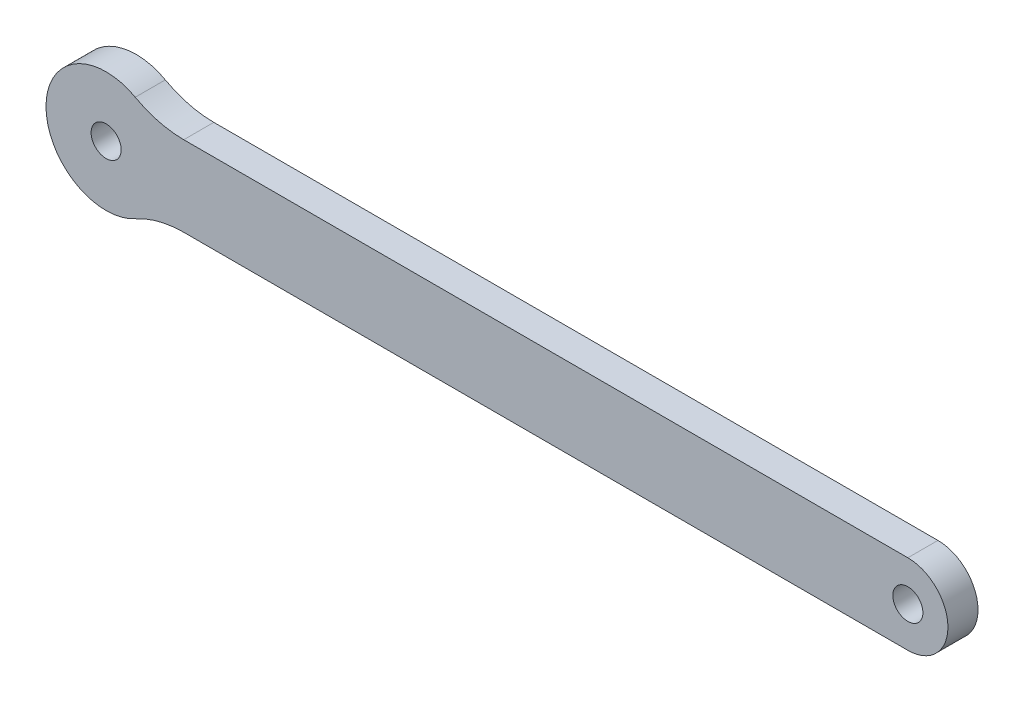
ISO-10303-21;
HEADER;
FILE_DESCRIPTION(('STEP AP214'),'2;1');
FILE_NAME('part.step','',(''),(''),'','','');
FILE_SCHEMA(('AUTOMOTIVE_DESIGN { 1 0 10303 214 1 1 1 1 }'));
ENDSEC;
DATA;
#1=APPLICATION_CONTEXT('core data for automotive mechanical design processes');
#2=APPLICATION_PROTOCOL_DEFINITION('international standard','automotive_design',2000,#1);
#3=PRODUCT_CONTEXT('',#1,'mechanical');
#4=PRODUCT('Part','Part','',(#3));
#5=PRODUCT_RELATED_PRODUCT_CATEGORY('part','',(#4));
#6=PRODUCT_DEFINITION_FORMATION('','',#4);
#7=PRODUCT_DEFINITION_CONTEXT('part definition',#1,'design');
#8=PRODUCT_DEFINITION('design','',#6,#7);
#9=PRODUCT_DEFINITION_SHAPE('','',#8);
#10=(LENGTH_UNIT() NAMED_UNIT(*) SI_UNIT(.MILLI.,.METRE.));
#11=(NAMED_UNIT(*) PLANE_ANGLE_UNIT() SI_UNIT($,.RADIAN.));
#12=(NAMED_UNIT(*) SI_UNIT($,.STERADIAN.) SOLID_ANGLE_UNIT());
#13=UNCERTAINTY_MEASURE_WITH_UNIT(LENGTH_MEASURE(1.E-05),#10,'distance_accuracy_value','');
#14=(GEOMETRIC_REPRESENTATION_CONTEXT(3) GLOBAL_UNCERTAINTY_ASSIGNED_CONTEXT((#13)) GLOBAL_UNIT_ASSIGNED_CONTEXT((#10,
#11,#12)) REPRESENTATION_CONTEXT('',''));
#15=CARTESIAN_POINT('',(0.,0.,0.));
#16=DIRECTION('',(0.,0.,1.));
#17=DIRECTION('',(1.,0.,0.));
#18=AXIS2_PLACEMENT_3D('',#15,#16,#17);
#19=CARTESIAN_POINT('',(126.393109195494,47.5642070296617,3.));
#20=DIRECTION('',(0.,0.,-1.));
#21=DIRECTION('',(-1.,0.,0.));
#22=AXIS2_PLACEMENT_3D('',#19,#20,#21);
#23=PLANE('',#22);
#24=CARTESIAN_POINT('',(118.647142503079,61.5642070296617,3.));
#25=DIRECTION('',(0.,0.,1.));
#26=DIRECTION('',(1.,0.,0.));
#27=AXIS2_PLACEMENT_3D('',#24,#25,#26);
#28=CIRCLE('',#27,1.5);
#29=CARTESIAN_POINT('',(120.147142503079,61.5642070296617,3.));
#30=VERTEX_POINT('',#29);
#31=EDGE_CURVE('E126',#30,#30,#28,.T.);
#32=ORIENTED_EDGE('',*,*,#31,.F.);
#33=EDGE_LOOP('',(#32));
#34=FACE_BOUND('',#33,.T.);
#35=CARTESIAN_POINT('',(126.393109195494,47.5642070296617,3.));
#36=DIRECTION('',(0.,0.,-1.));
#37=DIRECTION('',(-1.,0.,0.));
#38=AXIS2_PLACEMENT_3D('',#35,#36,#37);
#39=CIRCLE('',#38,10.);
#40=CARTESIAN_POINT('',(121.551880012734,56.3142070296617,3.));
#41=VERTEX_POINT('',#40);
#42=CARTESIAN_POINT('',(126.393109195494,57.5642070296616,3.));
#43=VERTEX_POINT('',#42);
#44=EDGE_CURVE('E133',#41,#43,#39,.T.);
#45=ORIENTED_EDGE('',*,*,#44,.T.);
#46=DIRECTION('',(1.,0.,0.));
#47=VECTOR('',#46,1.);
#48=CARTESIAN_POINT('',(126.393109195494,57.5642070296616,3.));
#49=LINE('',#48,#47);
#50=CARTESIAN_POINT('',(198.647142503079,57.5642070296617,3.));
#51=VERTEX_POINT('',#50);
#52=EDGE_CURVE('E91',#43,#51,#49,.T.);
#53=ORIENTED_EDGE('',*,*,#52,.T.);
#54=CARTESIAN_POINT('',(198.647142503079,61.5642070296617,3.));
#55=DIRECTION('',(0.,0.,1.));
#56=DIRECTION('',(1.,0.,0.));
#57=AXIS2_PLACEMENT_3D('',#54,#55,#56);
#58=CIRCLE('',#57,4.);
#59=CARTESIAN_POINT('',(198.647142503079,65.5642070296616,3.));
#60=VERTEX_POINT('',#59);
#61=EDGE_CURVE('E104',#51,#60,#58,.T.);
#62=ORIENTED_EDGE('',*,*,#61,.T.);
#63=DIRECTION('',(-1.,0.,0.));
#64=VECTOR('',#63,1.);
#65=CARTESIAN_POINT('',(198.647142503079,65.5642070296616,3.));
#66=LINE('',#65,#64);
#67=CARTESIAN_POINT('',(126.393109195494,65.5642070296616,3.));
#68=VERTEX_POINT('',#67);
#69=EDGE_CURVE('E98',#60,#68,#66,.T.);
#70=ORIENTED_EDGE('',*,*,#69,.T.);
#71=CARTESIAN_POINT('',(126.393109195494,75.5642070296616,3.));
#72=DIRECTION('',(0.,0.,-1.));
#73=DIRECTION('',(1.,0.,0.));
#74=AXIS2_PLACEMENT_3D('',#71,#72,#73);
#75=CIRCLE('',#74,10.);
#76=CARTESIAN_POINT('',(121.551880012734,66.8142070296616,3.));
#77=VERTEX_POINT('',#76);
#78=EDGE_CURVE('E102',#68,#77,#75,.T.);
#79=ORIENTED_EDGE('',*,*,#78,.T.);
#80=CARTESIAN_POINT('',(118.647142503079,61.5642070296617,3.));
#81=DIRECTION('',(0.,0.,1.));
#82=DIRECTION('',(1.,0.,0.));
#83=AXIS2_PLACEMENT_3D('',#80,#81,#82);
#84=CIRCLE('',#83,6.);
#85=EDGE_CURVE('E54',#77,#41,#84,.T.);
#86=ORIENTED_EDGE('',*,*,#85,.T.);
#87=EDGE_LOOP('',(#45,#53,#62,#70,#79,#86));
#88=FACE_BOUND('',#87,.T.);
#89=CARTESIAN_POINT('',(198.647142503079,61.5642070296617,3.));
#90=DIRECTION('',(0.,0.,1.));
#91=DIRECTION('',(1.,0.,0.));
#92=AXIS2_PLACEMENT_3D('',#89,#90,#91);
#93=CIRCLE('',#92,1.5);
#94=CARTESIAN_POINT('',(200.147142503079,61.5642070296617,3.));
#95=VERTEX_POINT('',#94);
#96=EDGE_CURVE('E176',#95,#95,#93,.T.);
#97=ORIENTED_EDGE('',*,*,#96,.F.);
#98=EDGE_LOOP('',(#97));
#99=FACE_BOUND('',#98,.T.);
#100=ADVANCED_FACE('F37',(#34,#88,#99),#23,.F.);
#101=CARTESIAN_POINT('',(126.393109195494,47.5642070296617,0.));
#102=DIRECTION('',(0.,0.,-1.));
#103=DIRECTION('',(-1.,0.,0.));
#104=AXIS2_PLACEMENT_3D('',#101,#102,#103);
#105=PLANE('',#104);
#106=CARTESIAN_POINT('',(118.647142503079,61.5642070296617,0.));
#107=DIRECTION('',(0.,0.,1.));
#108=DIRECTION('',(1.,0.,0.));
#109=AXIS2_PLACEMENT_3D('',#106,#107,#108);
#110=CIRCLE('',#109,1.5);
#111=CARTESIAN_POINT('',(120.147142503079,61.5642070296617,0.));
#112=VERTEX_POINT('',#111);
#113=EDGE_CURVE('E181',#112,#112,#110,.T.);
#114=ORIENTED_EDGE('',*,*,#113,.T.);
#115=EDGE_LOOP('',(#114));
#116=FACE_BOUND('',#115,.T.);
#117=CARTESIAN_POINT('',(126.393109195494,47.5642070296617,0.));
#118=DIRECTION('',(0.,0.,-1.));
#119=DIRECTION('',(-1.,0.,0.));
#120=AXIS2_PLACEMENT_3D('',#117,#118,#119);
#121=CIRCLE('',#120,10.);
#122=CARTESIAN_POINT('',(121.551880012734,56.3142070296617,0.));
#123=VERTEX_POINT('',#122);
#124=CARTESIAN_POINT('',(126.393109195494,57.5642070296616,0.));
#125=VERTEX_POINT('',#124);
#126=EDGE_CURVE('E122',#123,#125,#121,.T.);
#127=ORIENTED_EDGE('',*,*,#126,.F.);
#128=CARTESIAN_POINT('',(118.647142503079,61.5642070296617,0.));
#129=DIRECTION('',(0.,0.,1.));
#130=DIRECTION('',(1.,0.,0.));
#131=AXIS2_PLACEMENT_3D('',#128,#129,#130);
#132=CIRCLE('',#131,6.);
#133=CARTESIAN_POINT('',(121.551880012734,66.8142070296616,0.));
#134=VERTEX_POINT('',#133);
#135=EDGE_CURVE('E83',#134,#123,#132,.T.);
#136=ORIENTED_EDGE('',*,*,#135,.F.);
#137=CARTESIAN_POINT('',(126.393109195494,75.5642070296616,0.));
#138=DIRECTION('',(0.,0.,-1.));
#139=DIRECTION('',(1.,0.,0.));
#140=AXIS2_PLACEMENT_3D('',#137,#138,#139);
#141=CIRCLE('',#140,10.);
#142=CARTESIAN_POINT('',(126.393109195494,65.5642070296616,0.));
#143=VERTEX_POINT('',#142);
#144=EDGE_CURVE('E77',#143,#134,#141,.T.);
#145=ORIENTED_EDGE('',*,*,#144,.F.);
#146=DIRECTION('',(-1.,0.,0.));
#147=VECTOR('',#146,1.);
#148=CARTESIAN_POINT('',(198.647142503079,65.5642070296616,0.));
#149=LINE('',#148,#147);
#150=CARTESIAN_POINT('',(198.647142503079,65.5642070296616,0.));
#151=VERTEX_POINT('',#150);
#152=EDGE_CURVE('E112',#151,#143,#149,.T.);
#153=ORIENTED_EDGE('',*,*,#152,.F.);
#154=CARTESIAN_POINT('',(198.647142503079,61.5642070296617,0.));
#155=DIRECTION('',(0.,0.,1.));
#156=DIRECTION('',(1.,0.,0.));
#157=AXIS2_PLACEMENT_3D('',#154,#155,#156);
#158=CIRCLE('',#157,4.);
#159=CARTESIAN_POINT('',(198.647142503079,57.5642070296617,0.));
#160=VERTEX_POINT('',#159);
#161=EDGE_CURVE('E128',#160,#151,#158,.T.);
#162=ORIENTED_EDGE('',*,*,#161,.F.);
#163=DIRECTION('',(1.,0.,0.));
#164=VECTOR('',#163,1.);
#165=CARTESIAN_POINT('',(126.393109195494,57.5642070296616,0.));
#166=LINE('',#165,#164);
#167=EDGE_CURVE('E125',#125,#160,#166,.T.);
#168=ORIENTED_EDGE('',*,*,#167,.F.);
#169=EDGE_LOOP('',(#127,#136,#145,#153,#162,#168));
#170=FACE_BOUND('',#169,.T.);
#171=CARTESIAN_POINT('',(198.647142503079,61.5642070296617,0.));
#172=DIRECTION('',(0.,0.,1.));
#173=DIRECTION('',(1.,0.,0.));
#174=AXIS2_PLACEMENT_3D('',#171,#172,#173);
#175=CIRCLE('',#174,1.5);
#176=CARTESIAN_POINT('',(200.147142503079,61.5642070296617,0.));
#177=VERTEX_POINT('',#176);
#178=EDGE_CURVE('E179',#177,#177,#175,.T.);
#179=ORIENTED_EDGE('',*,*,#178,.T.);
#180=EDGE_LOOP('',(#179));
#181=FACE_BOUND('',#180,.T.);
#182=ADVANCED_FACE('F142',(#116,#170,#181),#105,.T.);
#183=CARTESIAN_POINT('',(126.393109195494,47.5642070296617,3.));
#184=DIRECTION('',(0.,0.,-1.));
#185=DIRECTION('',(-1.,0.,0.));
#186=AXIS2_PLACEMENT_3D('',#183,#184,#185);
#187=CYLINDRICAL_SURFACE('',#186,10.);
#188=ORIENTED_EDGE('',*,*,#126,.T.);
#189=DIRECTION('',(0.,0.,-1.));
#190=VECTOR('',#189,1.);
#191=CARTESIAN_POINT('',(126.393109195494,57.5642070296616,3.));
#192=LINE('',#191,#190);
#193=EDGE_CURVE('E11',#43,#125,#192,.T.);
#194=ORIENTED_EDGE('',*,*,#193,.F.);
#195=ORIENTED_EDGE('',*,*,#44,.F.);
#196=DIRECTION('',(0.,0.,-1.));
#197=VECTOR('',#196,1.);
#198=CARTESIAN_POINT('',(121.551880012734,56.3142070296617,3.));
#199=LINE('',#198,#197);
#200=EDGE_CURVE('E118',#41,#123,#199,.T.);
#201=ORIENTED_EDGE('',*,*,#200,.T.);
#202=EDGE_LOOP('',(#188,#194,#195,#201));
#203=FACE_BOUND('',#202,.T.);
#204=ADVANCED_FACE('F39',(#203),#187,.F.);
#205=CARTESIAN_POINT('',(126.393109195494,57.5642070296616,3.));
#206=DIRECTION('',(0.,1.,0.));
#207=DIRECTION('',(-1.,0.,0.));
#208=AXIS2_PLACEMENT_3D('',#205,#206,#207);
#209=PLANE('',#208);
#210=ORIENTED_EDGE('',*,*,#167,.T.);
#211=DIRECTION('',(0.,0.,-1.));
#212=VECTOR('',#211,1.);
#213=CARTESIAN_POINT('',(198.647142503079,57.5642070296617,3.));
#214=LINE('',#213,#212);
#215=EDGE_CURVE('E46',#51,#160,#214,.T.);
#216=ORIENTED_EDGE('',*,*,#215,.F.);
#217=ORIENTED_EDGE('',*,*,#52,.F.);
#218=ORIENTED_EDGE('',*,*,#193,.T.);
#219=EDGE_LOOP('',(#210,#216,#217,#218));
#220=FACE_BOUND('',#219,.T.);
#221=ADVANCED_FACE('F222',(#220),#209,.F.);
#222=CARTESIAN_POINT('',(198.647142503079,61.5642070296617,3.));
#223=DIRECTION('',(0.,0.,-1.));
#224=DIRECTION('',(-1.,0.,0.));
#225=AXIS2_PLACEMENT_3D('',#222,#223,#224);
#226=CYLINDRICAL_SURFACE('',#225,4.);
#227=ORIENTED_EDGE('',*,*,#161,.T.);
#228=DIRECTION('',(0.,0.,-1.));
#229=VECTOR('',#228,1.);
#230=CARTESIAN_POINT('',(198.647142503079,65.5642070296616,3.));
#231=LINE('',#230,#229);
#232=EDGE_CURVE('E113',#60,#151,#231,.T.);
#233=ORIENTED_EDGE('',*,*,#232,.F.);
#234=ORIENTED_EDGE('',*,*,#61,.F.);
#235=ORIENTED_EDGE('',*,*,#215,.T.);
#236=EDGE_LOOP('',(#227,#233,#234,#235));
#237=FACE_BOUND('',#236,.T.);
#238=ADVANCED_FACE('F139',(#237),#226,.T.);
#239=CARTESIAN_POINT('',(198.647142503079,65.5642070296616,3.));
#240=DIRECTION('',(0.,-1.,0.));
#241=DIRECTION('',(1.,0.,0.));
#242=AXIS2_PLACEMENT_3D('',#239,#240,#241);
#243=PLANE('',#242);
#244=ORIENTED_EDGE('',*,*,#152,.T.);
#245=DIRECTION('',(0.,0.,-1.));
#246=VECTOR('',#245,1.);
#247=CARTESIAN_POINT('',(126.393109195494,65.5642070296616,3.));
#248=LINE('',#247,#246);
#249=EDGE_CURVE('E109',#68,#143,#248,.T.);
#250=ORIENTED_EDGE('',*,*,#249,.F.);
#251=ORIENTED_EDGE('',*,*,#69,.F.);
#252=ORIENTED_EDGE('',*,*,#232,.T.);
#253=EDGE_LOOP('',(#244,#250,#251,#252));
#254=FACE_BOUND('',#253,.T.);
#255=ADVANCED_FACE('F110',(#254),#243,.F.);
#256=CARTESIAN_POINT('',(126.393109195494,75.5642070296616,3.));
#257=DIRECTION('',(0.,0.,-1.));
#258=DIRECTION('',(-1.,0.,0.));
#259=AXIS2_PLACEMENT_3D('',#256,#257,#258);
#260=CYLINDRICAL_SURFACE('',#259,10.);
#261=ORIENTED_EDGE('',*,*,#144,.T.);
#262=DIRECTION('',(0.,0.,-1.));
#263=VECTOR('',#262,1.);
#264=CARTESIAN_POINT('',(121.551880012734,66.8142070296616,3.));
#265=LINE('',#264,#263);
#266=EDGE_CURVE('E114',#77,#134,#265,.T.);
#267=ORIENTED_EDGE('',*,*,#266,.F.);
#268=ORIENTED_EDGE('',*,*,#78,.F.);
#269=ORIENTED_EDGE('',*,*,#249,.T.);
#270=EDGE_LOOP('',(#261,#267,#268,#269));
#271=FACE_BOUND('',#270,.T.);
#272=ADVANCED_FACE('F116',(#271),#260,.F.);
#273=CARTESIAN_POINT('',(118.647142503079,61.5642070296617,3.));
#274=DIRECTION('',(0.,0.,-1.));
#275=DIRECTION('',(-1.,0.,0.));
#276=AXIS2_PLACEMENT_3D('',#273,#274,#275);
#277=CYLINDRICAL_SURFACE('',#276,6.);
#278=ORIENTED_EDGE('',*,*,#135,.T.);
#279=ORIENTED_EDGE('',*,*,#200,.F.);
#280=ORIENTED_EDGE('',*,*,#85,.F.);
#281=ORIENTED_EDGE('',*,*,#266,.T.);
#282=EDGE_LOOP('',(#278,#279,#280,#281));
#283=FACE_BOUND('',#282,.T.);
#284=ADVANCED_FACE('F147',(#283),#277,.T.);
#285=CARTESIAN_POINT('',(118.647142503079,61.5642070296617,3.));
#286=DIRECTION('',(0.,0.,-1.));
#287=DIRECTION('',(-1.,0.,0.));
#288=AXIS2_PLACEMENT_3D('',#285,#286,#287);
#289=CYLINDRICAL_SURFACE('',#288,1.5);
#290=ORIENTED_EDGE('',*,*,#31,.T.);
#291=EDGE_LOOP('',(#290));
#292=FACE_BOUND('',#291,.T.);
#293=ORIENTED_EDGE('',*,*,#113,.F.);
#294=EDGE_LOOP('',(#293));
#295=FACE_BOUND('',#294,.T.);
#296=ADVANCED_FACE('F149',(#292,#295),#289,.F.);
#297=CARTESIAN_POINT('',(198.647142503079,61.5642070296617,3.));
#298=DIRECTION('',(0.,0.,-1.));
#299=DIRECTION('',(-1.,0.,0.));
#300=AXIS2_PLACEMENT_3D('',#297,#298,#299);
#301=CYLINDRICAL_SURFACE('',#300,1.5);
#302=ORIENTED_EDGE('',*,*,#96,.T.);
#303=EDGE_LOOP('',(#302));
#304=FACE_BOUND('',#303,.T.);
#305=ORIENTED_EDGE('',*,*,#178,.F.);
#306=EDGE_LOOP('',(#305));
#307=FACE_BOUND('',#306,.T.);
#308=ADVANCED_FACE('F155',(#304,#307),#301,.F.);
#309=CLOSED_SHELL('',(#100,#182,#204,#221,#238,#255,#272,#284,#296,#308));
#310=MANIFOLD_SOLID_BREP('B2',#309);
#311=ADVANCED_BREP_SHAPE_REPRESENTATION('',(#18,#310),#14);
#312=SHAPE_DEFINITION_REPRESENTATION(#9,#311);
ENDSEC;
END-ISO-10303-21;
